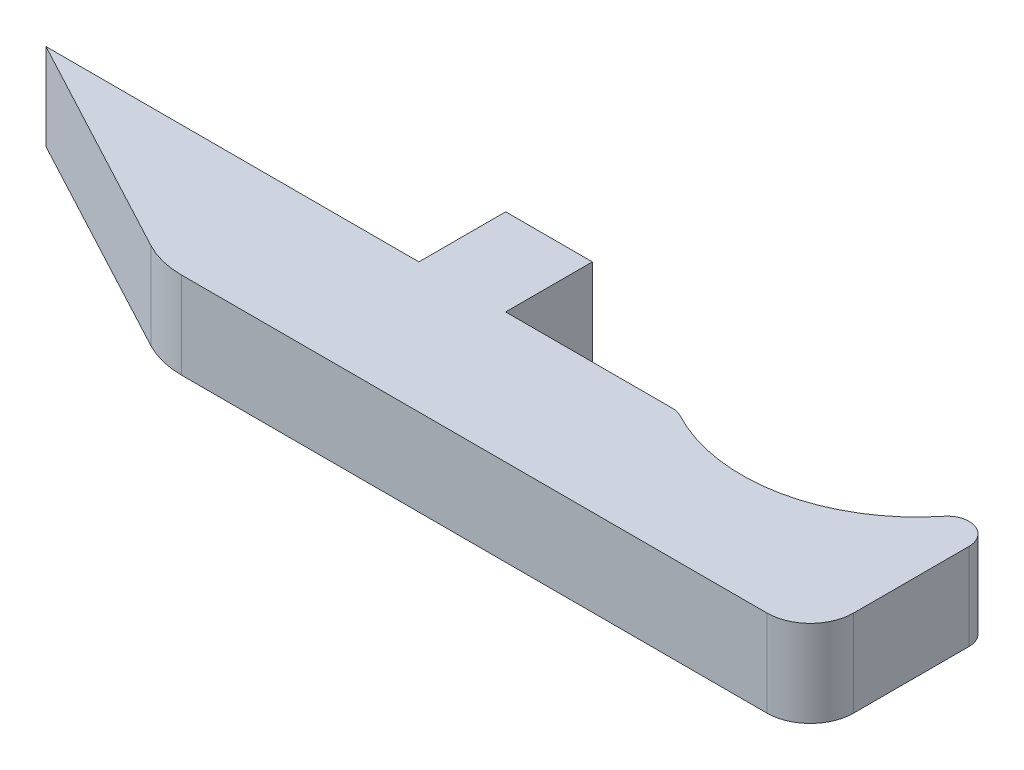
ISO-10303-21;
HEADER;
FILE_DESCRIPTION(('STEP AP214'),'2;1');
FILE_NAME('part.step','',(''),(''),'','','');
FILE_SCHEMA(('AUTOMOTIVE_DESIGN { 1 0 10303 214 1 1 1 1 }'));
ENDSEC;
DATA;
#1=APPLICATION_CONTEXT('core data for automotive mechanical design processes');
#2=APPLICATION_PROTOCOL_DEFINITION('international standard','automotive_design',2000,#1);
#3=PRODUCT_CONTEXT('',#1,'mechanical');
#4=PRODUCT('Part','Part','',(#3));
#5=PRODUCT_RELATED_PRODUCT_CATEGORY('part','',(#4));
#6=PRODUCT_DEFINITION_FORMATION('','',#4);
#7=PRODUCT_DEFINITION_CONTEXT('part definition',#1,'design');
#8=PRODUCT_DEFINITION('design','',#6,#7);
#9=PRODUCT_DEFINITION_SHAPE('','',#8);
#10=(LENGTH_UNIT() NAMED_UNIT(*) SI_UNIT(.MILLI.,.METRE.));
#11=(NAMED_UNIT(*) PLANE_ANGLE_UNIT() SI_UNIT($,.RADIAN.));
#12=(NAMED_UNIT(*) SI_UNIT($,.STERADIAN.) SOLID_ANGLE_UNIT());
#13=UNCERTAINTY_MEASURE_WITH_UNIT(LENGTH_MEASURE(1.E-05),#10,'distance_accuracy_value','');
#14=(GEOMETRIC_REPRESENTATION_CONTEXT(3) GLOBAL_UNCERTAINTY_ASSIGNED_CONTEXT((#13)) GLOBAL_UNIT_ASSIGNED_CONTEXT((#10,
#11,#12)) REPRESENTATION_CONTEXT('',''));
#15=CARTESIAN_POINT('',(0.,0.,0.));
#16=DIRECTION('',(0.,0.,1.));
#17=DIRECTION('',(1.,0.,0.));
#18=AXIS2_PLACEMENT_3D('',#15,#16,#17);
#19=CARTESIAN_POINT('',(0.,6.35,45.8687309916866));
#20=DIRECTION('',(0.,0.,1.));
#21=DIRECTION('',(1.,0.,0.));
#22=AXIS2_PLACEMENT_3D('',#19,#20,#21);
#23=PLANE('',#22);
#24=DIRECTION('',(0.,-1.,0.));
#25=VECTOR('',#24,1.);
#26=CARTESIAN_POINT('',(39.9394999999324,6.35,45.8687309916866));
#27=LINE('',#26,#25);
#28=CARTESIAN_POINT('',(39.9394999999324,6.35,45.8687309916866));
#29=VERTEX_POINT('',#28);
#30=CARTESIAN_POINT('',(39.9394999999324,0.,45.8687309916866));
#31=VERTEX_POINT('',#30);
#32=EDGE_CURVE('E71',#29,#31,#27,.T.);
#33=ORIENTED_EDGE('',*,*,#32,.F.);
#34=DIRECTION('',(-1.,0.,0.));
#35=VECTOR('',#34,1.);
#36=CARTESIAN_POINT('',(0.,6.35,45.8687309916866));
#37=LINE('',#36,#35);
#38=CARTESIAN_POINT('',(52.1487518651009,6.35,45.8687309916866));
#39=VERTEX_POINT('',#38);
#40=EDGE_CURVE('E187',#39,#29,#37,.T.);
#41=ORIENTED_EDGE('',*,*,#40,.F.);
#42=DIRECTION('',(0.,1.,0.));
#43=VECTOR('',#42,1.);
#44=CARTESIAN_POINT('',(52.1487518651009,0.,45.8687309916866));
#45=LINE('',#44,#43);
#46=CARTESIAN_POINT('',(52.1487518651009,0.,45.8687309916866));
#47=VERTEX_POINT('',#46);
#48=EDGE_CURVE('E219',#39,#47,#45,.F.);
#49=ORIENTED_EDGE('',*,*,#48,.T.);
#50=DIRECTION('',(-1.,0.,0.));
#51=VECTOR('',#50,1.);
#52=CARTESIAN_POINT('',(0.,0.,45.8687309916866));
#53=LINE('',#52,#51);
#54=EDGE_CURVE('E203',#47,#31,#53,.T.);
#55=ORIENTED_EDGE('',*,*,#54,.T.);
#56=EDGE_LOOP('',(#33,#41,#49,#55));
#57=FACE_BOUND('',#56,.T.);
#58=ADVANCED_FACE('F47',(#57),#23,.F.);
#59=DIRECTION('',(0.,1.,0.));
#60=VECTOR('',#59,1.);
#61=CARTESIAN_POINT('',(33.5894999999324,6.35,45.8687309916866));
#62=LINE('',#61,#60);
#63=CARTESIAN_POINT('',(33.5894999999324,0.,45.8687309916866));
#64=VERTEX_POINT('',#63);
#65=CARTESIAN_POINT('',(33.5894999999324,6.35,45.8687309916866));
#66=VERTEX_POINT('',#65);
#67=EDGE_CURVE('E167',#64,#66,#62,.T.);
#68=ORIENTED_EDGE('',*,*,#67,.F.);
#69=CARTESIAN_POINT('',(6.28449999993243,0.,45.8687309916866));
#70=VERTEX_POINT('',#69);
#71=EDGE_CURVE('E176',#64,#70,#53,.T.);
#72=ORIENTED_EDGE('',*,*,#71,.T.);
#73=DIRECTION('',(0.,-1.,0.));
#74=VECTOR('',#73,1.);
#75=CARTESIAN_POINT('',(6.28449999993243,6.35,45.8687309916866));
#76=LINE('',#75,#74);
#77=CARTESIAN_POINT('',(6.28449999993243,6.35,45.8687309916866));
#78=VERTEX_POINT('',#77);
#79=EDGE_CURVE('E201',#78,#70,#76,.T.);
#80=ORIENTED_EDGE('',*,*,#79,.F.);
#81=EDGE_CURVE('E63',#66,#78,#37,.T.);
#82=ORIENTED_EDGE('',*,*,#81,.F.);
#83=EDGE_LOOP('',(#68,#72,#80,#82));
#84=FACE_BOUND('',#83,.T.);
#85=ADVANCED_FACE('F313',(#84),#23,.F.);
#86=CARTESIAN_POINT('',(58.9432399959317,6.35,34.7435309916866));
#87=DIRECTION('',(0.,-1.,0.));
#88=DIRECTION('',(0.,0.,-1.));
#89=AXIS2_PLACEMENT_3D('',#86,#87,#88);
#90=CYLINDRICAL_SURFACE('',#89,12.827);
#91=CARTESIAN_POINT('',(58.9432399959317,0.,34.7435309916866));
#92=DIRECTION('',(0.,1.,0.));
#93=DIRECTION('',(0.,0.,1.));
#94=AXIS2_PLACEMENT_3D('',#91,#92,#93);
#95=CIRCLE('',#94,12.827);
#96=CARTESIAN_POINT('',(52.8970435094656,0.,46.0561538991756));
#97=VERTEX_POINT('',#96);
#98=CARTESIAN_POINT('',(68.944909599456,0.,42.774628932936));
#99=VERTEX_POINT('',#98);
#100=EDGE_CURVE('E171',#97,#99,#95,.T.);
#101=ORIENTED_EDGE('',*,*,#100,.F.);
#102=DIRECTION('',(0.,-1.,0.));
#103=VECTOR('',#102,1.);
#104=CARTESIAN_POINT('',(52.8970435094656,6.35,46.0561538991756));
#105=LINE('',#104,#103);
#106=CARTESIAN_POINT('',(52.8970435094656,6.35,46.0561538991756));
#107=VERTEX_POINT('',#106);
#108=EDGE_CURVE('E233',#97,#107,#105,.F.);
#109=ORIENTED_EDGE('',*,*,#108,.T.);
#110=CARTESIAN_POINT('',(58.9432399959317,6.35,34.7435309916866));
#111=DIRECTION('',(0.,1.,0.));
#112=DIRECTION('',(0.,0.,1.));
#113=AXIS2_PLACEMENT_3D('',#110,#111,#112);
#114=CIRCLE('',#113,12.827);
#115=CARTESIAN_POINT('',(68.944909599456,6.35,42.774628932936));
#116=VERTEX_POINT('',#115);
#117=EDGE_CURVE('E182',#107,#116,#114,.T.);
#118=ORIENTED_EDGE('',*,*,#117,.T.);
#119=DIRECTION('',(0.,-1.,0.));
#120=VECTOR('',#119,1.);
#121=CARTESIAN_POINT('',(68.944909599456,6.35,42.774628932936));
#122=LINE('',#121,#120);
#123=EDGE_CURVE('E229',#116,#99,#122,.T.);
#124=ORIENTED_EDGE('',*,*,#123,.T.);
#125=EDGE_LOOP('',(#101,#109,#118,#124));
#126=FACE_BOUND('',#125,.T.);
#127=ADVANCED_FACE('F288',(#126),#90,.F.);
#128=CARTESIAN_POINT('',(-17.653471350339,6.35,33.1027886420187));
#129=DIRECTION('',(0.470560234606516,0.,-0.88236787430587));
#130=DIRECTION('',(-0.88236787430587,0.,-0.470560234606516));
#131=AXIS2_PLACEMENT_3D('',#128,#129,#130);
#132=PLANE('',#131);
#133=DIRECTION('',(0.88236787430587,0.,0.470560234606516));
#134=VECTOR('',#133,1.);
#135=CARTESIAN_POINT('',(-17.653471350339,0.,33.1027886420187));
#136=LINE('',#135,#134);
#137=CARTESIAN_POINT('',(22.7445754544654,0.,54.6467669935289));
#138=VERTEX_POINT('',#137);
#139=EDGE_CURVE('E206',#70,#138,#136,.T.);
#140=ORIENTED_EDGE('',*,*,#139,.T.);
#141=DIRECTION('',(0.,-1.,0.));
#142=VECTOR('',#141,1.);
#143=CARTESIAN_POINT('',(22.7445754544654,6.35,54.6467669935289));
#144=LINE('',#143,#142);
#145=CARTESIAN_POINT('',(22.7445754544654,6.35,54.6467669935289));
#146=VERTEX_POINT('',#145);
#147=EDGE_CURVE('E252',#138,#146,#144,.F.);
#148=ORIENTED_EDGE('',*,*,#147,.T.);
#149=DIRECTION('',(0.88236787430587,0.,0.470560234606516));
#150=VECTOR('',#149,1.);
#151=CARTESIAN_POINT('',(-17.653471350339,6.35,33.1027886420187));
#152=LINE('',#151,#150);
#153=EDGE_CURVE('E190',#78,#146,#152,.T.);
#154=ORIENTED_EDGE('',*,*,#153,.F.);
#155=ORIENTED_EDGE('',*,*,#79,.T.);
#156=EDGE_LOOP('',(#140,#148,#154,#155));
#157=FACE_BOUND('',#156,.T.);
#158=ADVANCED_FACE('F316',(#157),#132,.F.);
#159=CARTESIAN_POINT('',(0.,6.35,55.3937309916866));
#160=DIRECTION('',(0.,0.,-1.));
#161=DIRECTION('',(-1.,0.,0.));
#162=AXIS2_PLACEMENT_3D('',#159,#160,#161);
#163=PLANE('',#162);
#164=DIRECTION('',(1.,0.,0.));
#165=VECTOR('',#164,1.);
#166=CARTESIAN_POINT('',(0.,0.,55.3937309916866));
#167=LINE('',#166,#165);
#168=CARTESIAN_POINT('',(25.7326329442167,0.,55.3937309916866));
#169=VERTEX_POINT('',#168);
#170=CARTESIAN_POINT('',(68.5952399959317,0.,55.3937309916866));
#171=VERTEX_POINT('',#170);
#172=EDGE_CURVE('E210',#169,#171,#167,.T.);
#173=ORIENTED_EDGE('',*,*,#172,.T.);
#174=DIRECTION('',(0.,-1.,0.));
#175=VECTOR('',#174,1.);
#176=CARTESIAN_POINT('',(68.5952399959317,6.35,55.3937309916866));
#177=LINE('',#176,#175);
#178=CARTESIAN_POINT('',(68.5952399959317,6.35,55.3937309916866));
#179=VERTEX_POINT('',#178);
#180=EDGE_CURVE('E56',#171,#179,#177,.F.);
#181=ORIENTED_EDGE('',*,*,#180,.T.);
#182=DIRECTION('',(1.,0.,0.));
#183=VECTOR('',#182,1.);
#184=CARTESIAN_POINT('',(0.,6.35,55.3937309916866));
#185=LINE('',#184,#183);
#186=CARTESIAN_POINT('',(25.7326329442167,6.35,55.3937309916866));
#187=VERTEX_POINT('',#186);
#188=EDGE_CURVE('E194',#187,#179,#185,.T.);
#189=ORIENTED_EDGE('',*,*,#188,.F.);
#190=DIRECTION('',(0.,-1.,0.));
#191=VECTOR('',#190,1.);
#192=CARTESIAN_POINT('',(25.7326329442167,6.35,55.3937309916866));
#193=LINE('',#192,#191);
#194=EDGE_CURVE('E245',#187,#169,#193,.T.);
#195=ORIENTED_EDGE('',*,*,#194,.T.);
#196=EDGE_LOOP('',(#173,#181,#189,#195));
#197=FACE_BOUND('',#196,.T.);
#198=ADVANCED_FACE('F268',(#197),#163,.F.);
#199=CARTESIAN_POINT('',(71.7702399959317,6.35,0.));
#200=DIRECTION('',(1.,0.,0.));
#201=DIRECTION('',(0.,0.,-1.));
#202=AXIS2_PLACEMENT_3D('',#199,#200,#201);
#203=PLANE('',#202);
#204=DIRECTION('',(0.,0.,1.));
#205=VECTOR('',#204,1.);
#206=CARTESIAN_POINT('',(71.7702399959317,6.35,0.));
#207=LINE('',#206,#205);
#208=CARTESIAN_POINT('',(71.7702399959317,6.35,43.7685766979421));
#209=VERTEX_POINT('',#208);
#210=CARTESIAN_POINT('',(71.7702399959317,6.35,52.2187309916866));
#211=VERTEX_POINT('',#210);
#212=EDGE_CURVE('E198',#209,#211,#207,.T.);
#213=ORIENTED_EDGE('',*,*,#212,.T.);
#214=DIRECTION('',(0.,-1.,0.));
#215=VECTOR('',#214,1.);
#216=CARTESIAN_POINT('',(71.7702399959317,0.,52.2187309916866));
#217=LINE('',#216,#215);
#218=CARTESIAN_POINT('',(71.7702399959317,0.,52.2187309916866));
#219=VERTEX_POINT('',#218);
#220=EDGE_CURVE('E258',#211,#219,#217,.T.);
#221=ORIENTED_EDGE('',*,*,#220,.T.);
#222=DIRECTION('',(0.,0.,1.));
#223=VECTOR('',#222,1.);
#224=CARTESIAN_POINT('',(71.7702399959317,0.,0.));
#225=LINE('',#224,#223);
#226=CARTESIAN_POINT('',(71.7702399959317,0.,43.7685766979421));
#227=VERTEX_POINT('',#226);
#228=EDGE_CURVE('E186',#227,#219,#225,.T.);
#229=ORIENTED_EDGE('',*,*,#228,.F.);
#230=DIRECTION('',(0.,-1.,0.));
#231=VECTOR('',#230,1.);
#232=CARTESIAN_POINT('',(71.7702399959317,6.35,43.7685766979421));
#233=LINE('',#232,#231);
#234=EDGE_CURVE('E242',#227,#209,#233,.F.);
#235=ORIENTED_EDGE('',*,*,#234,.T.);
#236=EDGE_LOOP('',(#213,#221,#229,#235));
#237=FACE_BOUND('',#236,.T.);
#238=ADVANCED_FACE('F280',(#237),#203,.T.);
#239=CARTESIAN_POINT('',(0.,6.35,0.));
#240=DIRECTION('',(0.,1.,0.));
#241=DIRECTION('',(0.,0.,1.));
#242=AXIS2_PLACEMENT_3D('',#239,#240,#241);
#243=PLANE('',#242);
#244=ORIENTED_EDGE('',*,*,#188,.T.);
#245=CARTESIAN_POINT('',(68.5952399959317,6.35,52.2187309916866));
#246=DIRECTION('',(0.,1.,0.));
#247=DIRECTION('',(0.,0.,1.));
#248=AXIS2_PLACEMENT_3D('',#245,#246,#247);
#249=CIRCLE('',#248,3.175);
#250=EDGE_CURVE('E11',#179,#211,#249,.T.);
#251=ORIENTED_EDGE('',*,*,#250,.T.);
#252=ORIENTED_EDGE('',*,*,#212,.F.);
#253=CARTESIAN_POINT('',(70.1827399959317,6.35,43.7685766979421));
#254=DIRECTION('',(0.,1.,0.));
#255=DIRECTION('',(0.,0.,1.));
#256=AXIS2_PLACEMENT_3D('',#253,#254,#255);
#257=CIRCLE('',#256,1.5875);
#258=EDGE_CURVE('E236',#209,#116,#257,.T.);
#259=ORIENTED_EDGE('',*,*,#258,.T.);
#260=ORIENTED_EDGE('',*,*,#117,.F.);
#261=CARTESIAN_POINT('',(52.1487518651009,6.35,47.4562309916866));
#262=DIRECTION('',(0.,1.,0.));
#263=DIRECTION('',(0.,0.,1.));
#264=AXIS2_PLACEMENT_3D('',#261,#262,#263);
#265=CIRCLE('',#264,1.5875);
#266=EDGE_CURVE('E239',#107,#39,#265,.T.);
#267=ORIENTED_EDGE('',*,*,#266,.T.);
#268=ORIENTED_EDGE('',*,*,#40,.T.);
#269=DIRECTION('',(0.,0.,1.));
#270=VECTOR('',#269,1.);
#271=CARTESIAN_POINT('',(39.9394999999324,6.35,39.5187309916866));
#272=LINE('',#271,#270);
#273=CARTESIAN_POINT('',(39.9394999999324,6.35,39.5187309916866));
#274=VERTEX_POINT('',#273);
#275=EDGE_CURVE('E295',#274,#29,#272,.T.);
#276=ORIENTED_EDGE('',*,*,#275,.F.);
#277=DIRECTION('',(1.,0.,0.));
#278=VECTOR('',#277,1.);
#279=CARTESIAN_POINT('',(39.9394999999324,6.35,39.5187309916866));
#280=LINE('',#279,#278);
#281=CARTESIAN_POINT('',(33.5894999999324,6.35,39.5187309916866));
#282=VERTEX_POINT('',#281);
#283=EDGE_CURVE('E162',#282,#274,#280,.T.);
#284=ORIENTED_EDGE('',*,*,#283,.F.);
#285=DIRECTION('',(0.,0.,1.));
#286=VECTOR('',#285,1.);
#287=CARTESIAN_POINT('',(33.5894999999324,6.35,39.5187309916866));
#288=LINE('',#287,#286);
#289=EDGE_CURVE('E178',#282,#66,#288,.T.);
#290=ORIENTED_EDGE('',*,*,#289,.T.);
#291=ORIENTED_EDGE('',*,*,#81,.T.);
#292=ORIENTED_EDGE('',*,*,#153,.T.);
#293=CARTESIAN_POINT('',(25.7326329442167,6.35,49.0437309916866));
#294=DIRECTION('',(0.,1.,0.));
#295=DIRECTION('',(0.,0.,1.));
#296=AXIS2_PLACEMENT_3D('',#293,#294,#295);
#297=CIRCLE('',#296,6.35);
#298=EDGE_CURVE('E255',#146,#187,#297,.T.);
#299=ORIENTED_EDGE('',*,*,#298,.T.);
#300=EDGE_LOOP('',(#244,#251,#252,#259,#260,#267,#268,#276,#284,#290,#291,#292,#299));
#301=FACE_BOUND('',#300,.T.);
#302=ADVANCED_FACE('F274',(#301),#243,.T.);
#303=CARTESIAN_POINT('',(0.,0.,0.));
#304=DIRECTION('',(0.,1.,0.));
#305=DIRECTION('',(0.,0.,1.));
#306=AXIS2_PLACEMENT_3D('',#303,#304,#305);
#307=PLANE('',#306);
#308=ORIENTED_EDGE('',*,*,#228,.T.);
#309=CARTESIAN_POINT('',(68.5952399959317,0.,52.2187309916866));
#310=DIRECTION('',(0.,1.,0.));
#311=DIRECTION('',(0.,0.,1.));
#312=AXIS2_PLACEMENT_3D('',#309,#310,#311);
#313=CIRCLE('',#312,3.175);
#314=EDGE_CURVE('E262',#219,#171,#313,.F.);
#315=ORIENTED_EDGE('',*,*,#314,.T.);
#316=ORIENTED_EDGE('',*,*,#172,.F.);
#317=CARTESIAN_POINT('',(25.7326329442167,0.,49.0437309916866));
#318=DIRECTION('',(0.,1.,0.));
#319=DIRECTION('',(0.,0.,1.));
#320=AXIS2_PLACEMENT_3D('',#317,#318,#319);
#321=CIRCLE('',#320,6.35);
#322=EDGE_CURVE('E249',#169,#138,#321,.F.);
#323=ORIENTED_EDGE('',*,*,#322,.T.);
#324=ORIENTED_EDGE('',*,*,#139,.F.);
#325=ORIENTED_EDGE('',*,*,#71,.F.);
#326=DIRECTION('',(0.,0.,1.));
#327=VECTOR('',#326,1.);
#328=CARTESIAN_POINT('',(33.5894999999324,0.,39.5187309916866));
#329=LINE('',#328,#327);
#330=CARTESIAN_POINT('',(33.5894999999324,0.,39.5187309916866));
#331=VERTEX_POINT('',#330);
#332=EDGE_CURVE('E152',#331,#64,#329,.T.);
#333=ORIENTED_EDGE('',*,*,#332,.F.);
#334=DIRECTION('',(-1.,0.,0.));
#335=VECTOR('',#334,1.);
#336=CARTESIAN_POINT('',(39.9394999999324,0.,39.5187309916866));
#337=LINE('',#336,#335);
#338=CARTESIAN_POINT('',(39.9394999999324,0.,39.5187309916866));
#339=VERTEX_POINT('',#338);
#340=EDGE_CURVE('E144',#339,#331,#337,.T.);
#341=ORIENTED_EDGE('',*,*,#340,.F.);
#342=DIRECTION('',(0.,0.,1.));
#343=VECTOR('',#342,1.);
#344=CARTESIAN_POINT('',(39.9394999999324,0.,39.5187309916866));
#345=LINE('',#344,#343);
#346=EDGE_CURVE('E150',#339,#31,#345,.T.);
#347=ORIENTED_EDGE('',*,*,#346,.T.);
#348=ORIENTED_EDGE('',*,*,#54,.F.);
#349=CARTESIAN_POINT('',(52.1487518651009,0.,47.4562309916866));
#350=DIRECTION('',(0.,1.,0.));
#351=DIRECTION('',(0.,0.,1.));
#352=AXIS2_PLACEMENT_3D('',#349,#350,#351);
#353=CIRCLE('',#352,1.5875);
#354=EDGE_CURVE('E226',#47,#97,#353,.F.);
#355=ORIENTED_EDGE('',*,*,#354,.T.);
#356=ORIENTED_EDGE('',*,*,#100,.T.);
#357=CARTESIAN_POINT('',(70.1827399959317,0.,43.7685766979421));
#358=DIRECTION('',(0.,1.,0.));
#359=DIRECTION('',(0.,0.,1.));
#360=AXIS2_PLACEMENT_3D('',#357,#358,#359);
#361=CIRCLE('',#360,1.5875);
#362=EDGE_CURVE('E223',#99,#227,#361,.F.);
#363=ORIENTED_EDGE('',*,*,#362,.T.);
#364=EDGE_LOOP('',(#308,#315,#316,#323,#324,#325,#333,#341,#347,#348,#355,#356,#363));
#365=FACE_BOUND('',#364,.T.);
#366=ADVANCED_FACE('F147',(#365),#307,.F.);
#367=CARTESIAN_POINT('',(52.1487518651009,6.35,47.4562309916866));
#368=DIRECTION('',(0.,-1.,0.));
#369=DIRECTION('',(0.,0.,-1.));
#370=AXIS2_PLACEMENT_3D('',#367,#368,#369);
#371=CYLINDRICAL_SURFACE('',#370,1.5875);
#372=ORIENTED_EDGE('',*,*,#266,.F.);
#373=ORIENTED_EDGE('',*,*,#108,.F.);
#374=ORIENTED_EDGE('',*,*,#354,.F.);
#375=ORIENTED_EDGE('',*,*,#48,.F.);
#376=EDGE_LOOP('',(#372,#373,#374,#375));
#377=FACE_BOUND('',#376,.T.);
#378=ADVANCED_FACE('F294',(#377),#371,.T.);
#379=CARTESIAN_POINT('',(70.1827399959317,6.35,43.7685766979421));
#380=DIRECTION('',(0.,-1.,0.));
#381=DIRECTION('',(0.,0.,-1.));
#382=AXIS2_PLACEMENT_3D('',#379,#380,#381);
#383=CYLINDRICAL_SURFACE('',#382,1.5875);
#384=ORIENTED_EDGE('',*,*,#258,.F.);
#385=ORIENTED_EDGE('',*,*,#234,.F.);
#386=ORIENTED_EDGE('',*,*,#362,.F.);
#387=ORIENTED_EDGE('',*,*,#123,.F.);
#388=EDGE_LOOP('',(#384,#385,#386,#387));
#389=FACE_BOUND('',#388,.T.);
#390=ADVANCED_FACE('F286',(#389),#383,.T.);
#391=CARTESIAN_POINT('',(25.7326329442167,6.35,49.0437309916866));
#392=DIRECTION('',(0.,-1.,0.));
#393=DIRECTION('',(0.,0.,-1.));
#394=AXIS2_PLACEMENT_3D('',#391,#392,#393);
#395=CYLINDRICAL_SURFACE('',#394,6.35);
#396=ORIENTED_EDGE('',*,*,#298,.F.);
#397=ORIENTED_EDGE('',*,*,#147,.F.);
#398=ORIENTED_EDGE('',*,*,#322,.F.);
#399=ORIENTED_EDGE('',*,*,#194,.F.);
#400=EDGE_LOOP('',(#396,#397,#398,#399));
#401=FACE_BOUND('',#400,.T.);
#402=ADVANCED_FACE('F319',(#401),#395,.T.);
#403=CARTESIAN_POINT('',(68.5952399959317,6.35,52.2187309916866));
#404=DIRECTION('',(0.,1.,0.));
#405=DIRECTION('',(0.,0.,1.));
#406=AXIS2_PLACEMENT_3D('',#403,#404,#405);
#407=CYLINDRICAL_SURFACE('',#406,3.175);
#408=ORIENTED_EDGE('',*,*,#250,.F.);
#409=ORIENTED_EDGE('',*,*,#180,.F.);
#410=ORIENTED_EDGE('',*,*,#314,.F.);
#411=ORIENTED_EDGE('',*,*,#220,.F.);
#412=EDGE_LOOP('',(#408,#409,#410,#411));
#413=FACE_BOUND('',#412,.T.);
#414=ADVANCED_FACE('F49',(#413),#407,.T.);
#415=CARTESIAN_POINT('',(39.9394999999324,6.35,39.5187309916866));
#416=DIRECTION('',(-1.,0.,0.));
#417=DIRECTION('',(0.,0.,1.));
#418=AXIS2_PLACEMENT_3D('',#415,#416,#417);
#419=PLANE('',#418);
#420=ORIENTED_EDGE('',*,*,#32,.T.);
#421=ORIENTED_EDGE('',*,*,#346,.F.);
#422=DIRECTION('',(0.,-1.,0.));
#423=VECTOR('',#422,1.);
#424=CARTESIAN_POINT('',(39.9394999999324,6.35,39.5187309916866));
#425=LINE('',#424,#423);
#426=EDGE_CURVE('E157',#274,#339,#425,.T.);
#427=ORIENTED_EDGE('',*,*,#426,.F.);
#428=ORIENTED_EDGE('',*,*,#275,.T.);
#429=EDGE_LOOP('',(#420,#421,#427,#428));
#430=FACE_BOUND('',#429,.T.);
#431=ADVANCED_FACE('F169',(#430),#419,.F.);
#432=CARTESIAN_POINT('',(33.5894999999324,6.35,39.5187309916866));
#433=DIRECTION('',(1.,0.,0.));
#434=DIRECTION('',(0.,0.,-1.));
#435=AXIS2_PLACEMENT_3D('',#432,#433,#434);
#436=PLANE('',#435);
#437=ORIENTED_EDGE('',*,*,#67,.T.);
#438=ORIENTED_EDGE('',*,*,#289,.F.);
#439=DIRECTION('',(0.,1.,0.));
#440=VECTOR('',#439,1.);
#441=CARTESIAN_POINT('',(33.5894999999324,6.35,39.5187309916866));
#442=LINE('',#441,#440);
#443=EDGE_CURVE('E156',#331,#282,#442,.T.);
#444=ORIENTED_EDGE('',*,*,#443,.F.);
#445=ORIENTED_EDGE('',*,*,#332,.T.);
#446=EDGE_LOOP('',(#437,#438,#444,#445));
#447=FACE_BOUND('',#446,.T.);
#448=ADVANCED_FACE('F310',(#447),#436,.F.);
#449=CARTESIAN_POINT('',(0.,0.,39.5187309916866));
#450=DIRECTION('',(0.,0.,-1.));
#451=DIRECTION('',(-1.,0.,0.));
#452=AXIS2_PLACEMENT_3D('',#449,#450,#451);
#453=PLANE('',#452);
#454=ORIENTED_EDGE('',*,*,#426,.T.);
#455=ORIENTED_EDGE('',*,*,#340,.T.);
#456=ORIENTED_EDGE('',*,*,#443,.T.);
#457=ORIENTED_EDGE('',*,*,#283,.T.);
#458=EDGE_LOOP('',(#454,#455,#456,#457));
#459=FACE_BOUND('',#458,.T.);
#460=ADVANCED_FACE('F160',(#459),#453,.T.);
#461=CLOSED_SHELL('',(#58,#85,#127,#158,#198,#238,#302,#366,#378,#390,#402,#414,#431,#448,#460));
#462=MANIFOLD_SOLID_BREP('B2',#461);
#463=ADVANCED_BREP_SHAPE_REPRESENTATION('',(#18,#462),#14);
#464=SHAPE_DEFINITION_REPRESENTATION(#9,#463);
ENDSEC;
END-ISO-10303-21;
